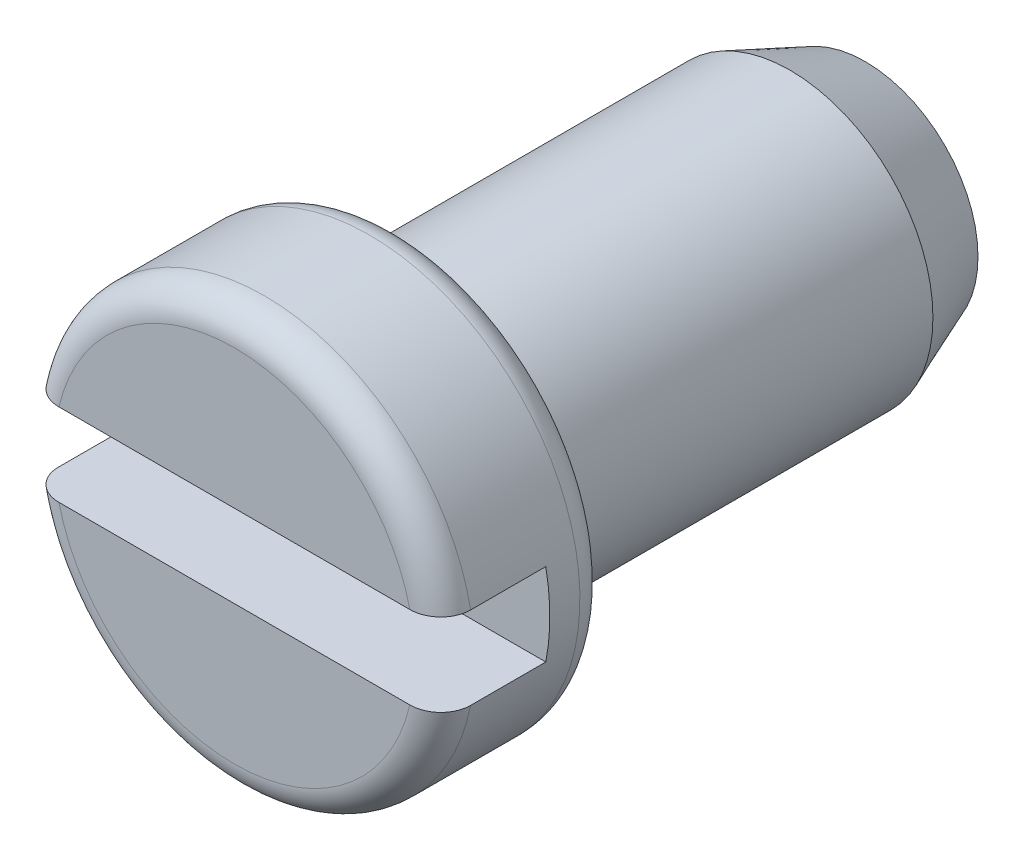
ISO-10303-21;
HEADER;
FILE_DESCRIPTION(('STEP AP214'),'2;1');
FILE_NAME('part.step','',(''),(''),'','','');
FILE_SCHEMA(('AUTOMOTIVE_DESIGN { 1 0 10303 214 1 1 1 1 }'));
ENDSEC;
DATA;
#1=APPLICATION_CONTEXT('core data for automotive mechanical design processes');
#2=APPLICATION_PROTOCOL_DEFINITION('international standard','automotive_design',2000,#1);
#3=PRODUCT_CONTEXT('',#1,'mechanical');
#4=PRODUCT('Part','Part','',(#3));
#5=PRODUCT_RELATED_PRODUCT_CATEGORY('part','',(#4));
#6=PRODUCT_DEFINITION_FORMATION('','',#4);
#7=PRODUCT_DEFINITION_CONTEXT('part definition',#1,'design');
#8=PRODUCT_DEFINITION('design','',#6,#7);
#9=PRODUCT_DEFINITION_SHAPE('','',#8);
#10=(LENGTH_UNIT() NAMED_UNIT(*) SI_UNIT(.MILLI.,.METRE.));
#11=(NAMED_UNIT(*) PLANE_ANGLE_UNIT() SI_UNIT($,.RADIAN.));
#12=(NAMED_UNIT(*) SI_UNIT($,.STERADIAN.) SOLID_ANGLE_UNIT());
#13=UNCERTAINTY_MEASURE_WITH_UNIT(LENGTH_MEASURE(1.E-05),#10,'distance_accuracy_value','');
#14=(GEOMETRIC_REPRESENTATION_CONTEXT(3) GLOBAL_UNCERTAINTY_ASSIGNED_CONTEXT((#13)) GLOBAL_UNIT_ASSIGNED_CONTEXT((#10,
#11,#12)) REPRESENTATION_CONTEXT('',''));
#15=CARTESIAN_POINT('',(0.,0.,0.));
#16=DIRECTION('',(0.,0.,1.));
#17=DIRECTION('',(1.,0.,0.));
#18=AXIS2_PLACEMENT_3D('',#15,#16,#17);
#19=CARTESIAN_POINT('',(0.,0.,0.4));
#20=DIRECTION('',(0.,0.,-1.));
#21=DIRECTION('',(-1.,0.,0.));
#22=AXIS2_PLACEMENT_3D('',#19,#20,#21);
#23=PLANE('',#22);
#24=DIRECTION('',(1.,0.,0.));
#25=VECTOR('',#24,1.);
#26=CARTESIAN_POINT('',(-1.55,0.275,0.4));
#27=LINE('',#26,#25);
#28=CARTESIAN_POINT('',(-1.37272539132962,0.275,0.4));
#29=VERTEX_POINT('',#28);
#30=CARTESIAN_POINT('',(1.37272539132912,0.275,0.4));
#31=VERTEX_POINT('',#30);
#32=EDGE_CURVE('E81',#29,#31,#27,.T.);
#33=ORIENTED_EDGE('',*,*,#32,.F.);
#34=CARTESIAN_POINT('',(0.,0.,0.4));
#35=DIRECTION('',(0.,0.,1.));
#36=DIRECTION('',(1.,0.,0.));
#37=AXIS2_PLACEMENT_3D('',#34,#35,#36);
#38=CIRCLE('',#37,1.4);
#39=CARTESIAN_POINT('',(-1.37272539132912,-0.275,0.4));
#40=VERTEX_POINT('',#39);
#41=EDGE_CURVE('E20',#40,#29,#38,.F.);
#42=ORIENTED_EDGE('',*,*,#41,.F.);
#43=DIRECTION('',(-1.,0.,0.));
#44=VECTOR('',#43,1.);
#45=CARTESIAN_POINT('',(1.55,-0.275,0.4));
#46=LINE('',#45,#44);
#47=CARTESIAN_POINT('',(1.37272539132912,-0.275,0.4));
#48=VERTEX_POINT('',#47);
#49=EDGE_CURVE('E101',#48,#40,#46,.T.);
#50=ORIENTED_EDGE('',*,*,#49,.F.);
#51=CARTESIAN_POINT('',(0.,0.,0.4));
#52=DIRECTION('',(0.,0.,1.));
#53=DIRECTION('',(1.,0.,0.));
#54=AXIS2_PLACEMENT_3D('',#51,#52,#53);
#55=CIRCLE('',#54,1.4);
#56=EDGE_CURVE('E79',#31,#48,#55,.F.);
#57=ORIENTED_EDGE('',*,*,#56,.F.);
#58=EDGE_LOOP('',(#33,#42,#50,#57));
#59=FACE_BOUND('',#58,.T.);
#60=ADVANCED_FACE('F17',(#59),#23,.F.);
#61=CARTESIAN_POINT('',(-1.55,0.275,0.4));
#62=DIRECTION('',(0.,-1.,0.));
#63=DIRECTION('',(1.,0.,0.));
#64=AXIS2_PLACEMENT_3D('',#61,#62,#63);
#65=PLANE('',#64);
#66=CARTESIAN_POINT('',(-1.168064638622,0.275,1.1));
#67=CARTESIAN_POINT('',(-1.17979474619244,0.275000000000899,1.10000900892487));
#68=CARTESIAN_POINT('',(-1.19152507678912,0.275000000000449,1.09902268463243));
#69=CARTESIAN_POINT('',(-1.21465961916008,0.274999999999551,1.09511289767747));
#70=CARTESIAN_POINT('',(-1.22606379501587,0.274999999999101,1.09218922251046));
#71=CARTESIAN_POINT('',(-1.24822679158968,0.2750000000009,1.08445477754249));
#72=CARTESIAN_POINT('',(-1.25898501760047,0.27500000000315,1.07964229858439));
#73=CARTESIAN_POINT('',(-1.27951893103669,0.274999999996852,1.06825432297092));
#74=CARTESIAN_POINT('',(-1.2892950745387,0.274999999988309,1.06167964992609));
#75=CARTESIAN_POINT('',(-1.30742885711329,0.274999999990221,1.04705254625198));
#76=CARTESIAN_POINT('',(-1.31580565043505,0.275000000000391,1.0390238749874));
#77=CARTESIAN_POINT('',(-1.33105410531582,0.274999999999609,1.02164641569087));
#78=CARTESIAN_POINT('',(-1.33792608226181,0.27499999998866,1.01229790495434));
#79=CARTESIAN_POINT('',(-1.3498135054974,0.274999999988767,0.992766466030646));
#80=CARTESIAN_POINT('',(-1.35486603138525,0.274999999999351,0.982606069770023));
#81=CARTESIAN_POINT('',(-1.36315638148696,0.275000000000648,0.961574435688257));
#82=CARTESIAN_POINT('',(-1.36639581565538,0.274999999991379,0.950703838108876));
#83=CARTESIAN_POINT('',(-1.37002349346129,0.274999999992961,0.933122145238303));
#84=CARTESIAN_POINT('',(-1.37103620489451,0.274999999997118,0.926533700301215));
#85=CARTESIAN_POINT('',(-1.372386912745,0.275000000002878,0.913297877139153));
#86=CARTESIAN_POINT('',(-1.37272590503939,0.275000000004483,0.906650600510395));
#87=CARTESIAN_POINT('',(-1.37272539132924,0.274999999999991,0.900000000000005));
#88=B_SPLINE_CURVE_WITH_KNOTS('',3,(#66,#67,#68,#69,#70,#71,#72,#73,#74,#75,#76,#77,#78,#79,#80,
#81,#82,#83,#84,#85,#86,#87),.UNSPECIFIED.,.F.,.F.,(4,2,2,2,2,2,2,2,2,2,4),(0.,
0.0351495831407126,0.0703030224135915,0.105488345247945,0.140657251830126,0.175296238170142,
0.209927957734105,0.243807528246284,0.277656967101562,0.297623162227171,0.317559821736661),.UNSPECIFIED.);
#89=CARTESIAN_POINT('',(-1.168064638622,0.275,1.1));
#90=VERTEX_POINT('',#89);
#91=CARTESIAN_POINT('',(-1.37272539132962,0.275,0.9));
#92=VERTEX_POINT('',#91);
#93=EDGE_CURVE('E90',#90,#92,#88,.T.);
#94=ORIENTED_EDGE('',*,*,#93,.T.);
#95=DIRECTION('',(0.,0.,1.));
#96=VECTOR('',#95,1.);
#97=CARTESIAN_POINT('',(-1.37272539133,0.275,0.4));
#98=LINE('',#97,#96);
#99=EDGE_CURVE('E72',#92,#29,#98,.F.);
#100=ORIENTED_EDGE('',*,*,#99,.T.);
#101=ORIENTED_EDGE('',*,*,#32,.T.);
#102=DIRECTION('',(0.,0.,1.));
#103=VECTOR('',#102,1.);
#104=CARTESIAN_POINT('',(1.372725391329,0.275,0.4));
#105=LINE('',#104,#103);
#106=CARTESIAN_POINT('',(1.37272539132912,0.275,0.9));
#107=VERTEX_POINT('',#106);
#108=EDGE_CURVE('E85',#31,#107,#105,.T.);
#109=ORIENTED_EDGE('',*,*,#108,.T.);
#110=CARTESIAN_POINT('',(1.37272539132923,0.275,0.9));
#111=CARTESIAN_POINT('',(1.37273572942247,0.275,0.911086101343287));
#112=CARTESIAN_POINT('',(1.37178597217092,0.275,0.922168228237445));
#113=CARTESIAN_POINT('',(1.36804386496671,0.275000000000001,0.944002810205124));
#114=CARTESIAN_POINT('',(1.36525388933003,0.275000000000001,0.954755671426613));
#115=CARTESIAN_POINT('',(1.35790742588791,0.275000000000001,0.975643414756284));
#116=CARTESIAN_POINT('',(1.35335038323878,0.275,0.985778101605212));
#117=CARTESIAN_POINT('',(1.34261311878456,0.275000000000001,1.00514589252457));
#118=CARTESIAN_POINT('',(1.33643295835292,0.275000000000001,1.01437903066631));
#119=CARTESIAN_POINT('',(1.322579909604,0.275000000000001,1.03176413579918));
#120=CARTESIAN_POINT('',(1.31489589333472,0.275,1.03990723001668));
#121=CARTESIAN_POINT('',(1.29829140126117,0.275,1.05481705570486));
#122=CARTESIAN_POINT('',(1.28937073967939,0.275000000000001,1.06158357999999));
#123=CARTESIAN_POINT('',(1.27037008819324,0.275000000000001,1.07368543886463));
#124=CARTESIAN_POINT('',(1.26027143895148,0.275,1.07899144095497));
#125=CARTESIAN_POINT('',(1.23934070951141,0.275000000000001,1.08787313057687));
#126=CARTESIAN_POINT('',(1.22850877690593,0.275000000000002,1.09144916513707));
#127=CARTESIAN_POINT('',(1.20937822381537,0.274999999999999,1.09607683913528));
#128=CARTESIAN_POINT('',(1.20117826995077,0.274999999999996,1.09754809729308));
#129=CARTESIAN_POINT('',(1.18467449380895,0.275000000000004,1.09950964714614));
#130=CARTESIAN_POINT('',(1.17637084906966,0.275000000000015,1.10000143191338));
#131=CARTESIAN_POINT('',(1.16806463862198,0.275000000000041,1.1));
#132=B_SPLINE_CURVE_WITH_KNOTS('',3,(#110,#111,#112,#113,#114,#115,#116,#117,#118,#119,#120,
#121,#122,#123,#124,#125,#126,#127,#128,#129,#130,#131),.UNSPECIFIED.,.F.,.F.,(4,2,2,2,2,2,2,2,
2,2,4),(0.,0.0332117839812641,0.0663808005275269,0.0995602403012769,0.132738425672459,
0.16617209183135,0.199610786083897,0.23367881316475,0.267740003418682,0.292676943506943,
0.31757584148912),.UNSPECIFIED.);
#133=CARTESIAN_POINT('',(1.168064638622,0.275,1.1));
#134=VERTEX_POINT('',#133);
#135=EDGE_CURVE('E94',#107,#134,#132,.T.);
#136=ORIENTED_EDGE('',*,*,#135,.T.);
#137=DIRECTION('',(-1.,0.,0.));
#138=VECTOR('',#137,1.);
#139=CARTESIAN_POINT('',(0.,0.275,1.1));
#140=LINE('',#139,#138);
#141=EDGE_CURVE('E176',#134,#90,#140,.T.);
#142=ORIENTED_EDGE('',*,*,#141,.T.);
#143=EDGE_LOOP('',(#94,#100,#101,#109,#136,#142));
#144=FACE_BOUND('',#143,.T.);
#145=ADVANCED_FACE('F88',(#144),#65,.T.);
#146=CARTESIAN_POINT('',(1.55,-0.275,0.4));
#147=DIRECTION('',(0.,1.,0.));
#148=DIRECTION('',(-1.,0.,0.));
#149=AXIS2_PLACEMENT_3D('',#146,#147,#148);
#150=PLANE('',#149);
#151=ORIENTED_EDGE('',*,*,#49,.T.);
#152=DIRECTION('',(0.,0.,1.));
#153=VECTOR('',#152,1.);
#154=CARTESIAN_POINT('',(-1.372725391329,-0.275,0.4));
#155=LINE('',#154,#153);
#156=CARTESIAN_POINT('',(-1.37272539132912,-0.275000000000001,0.9));
#157=VERTEX_POINT('',#156);
#158=EDGE_CURVE('E75',#40,#157,#155,.T.);
#159=ORIENTED_EDGE('',*,*,#158,.T.);
#160=CARTESIAN_POINT('',(-1.37272539132923,-0.275000000000001,0.9));
#161=CARTESIAN_POINT('',(-1.37273572942247,-0.275000000000001,0.911086101343287));
#162=CARTESIAN_POINT('',(-1.37178597217092,-0.275000000000001,0.922168228237444));
#163=CARTESIAN_POINT('',(-1.36804386496671,-0.275,0.944002810205124));
#164=CARTESIAN_POINT('',(-1.36525388933003,-0.275,0.954755671426613));
#165=CARTESIAN_POINT('',(-1.35790742588791,-0.275,0.975643414756284));
#166=CARTESIAN_POINT('',(-1.35335038323878,-0.275,0.985778101605212));
#167=CARTESIAN_POINT('',(-1.34261311878456,-0.275000000000001,1.00514589252457));
#168=CARTESIAN_POINT('',(-1.33643295835292,-0.275,1.01437903066631));
#169=CARTESIAN_POINT('',(-1.322579909604,-0.275,1.03176413579918));
#170=CARTESIAN_POINT('',(-1.31489589333472,-0.275,1.03990723001668));
#171=CARTESIAN_POINT('',(-1.29829140126118,-0.275,1.05481705570486));
#172=CARTESIAN_POINT('',(-1.28937073967939,-0.275,1.06158357999999));
#173=CARTESIAN_POINT('',(-1.27037008819324,-0.275,1.07368543886463));
#174=CARTESIAN_POINT('',(-1.26027143895148,-0.275,1.07899144095497));
#175=CARTESIAN_POINT('',(-1.23934070951141,-0.275000000000001,1.08787313057687));
#176=CARTESIAN_POINT('',(-1.22850877690593,-0.275000000000002,1.09144916513707));
#177=CARTESIAN_POINT('',(-1.20937822381537,-0.274999999999999,1.09607683913528));
#178=CARTESIAN_POINT('',(-1.20117826995077,-0.274999999999996,1.09754809729308));
#179=CARTESIAN_POINT('',(-1.18467449380895,-0.275000000000004,1.09950964714614));
#180=CARTESIAN_POINT('',(-1.17637084906966,-0.275000000000015,1.10000143191338));
#181=CARTESIAN_POINT('',(-1.16806463862198,-0.275000000000041,1.1));
#182=B_SPLINE_CURVE_WITH_KNOTS('',3,(#160,#161,#162,#163,#164,#165,#166,#167,#168,#169,#170,
#171,#172,#173,#174,#175,#176,#177,#178,#179,#180,#181),.UNSPECIFIED.,.F.,.F.,(4,2,2,2,2,2,2,2,
2,2,4),(0.,0.033211783981264,0.0663808005275267,0.0995602403012767,0.132738425672459,
0.166172091831349,0.199610786083897,0.233678813164749,0.267740003418681,0.292676943506943,
0.317575841489121),.UNSPECIFIED.);
#183=CARTESIAN_POINT('',(-1.168064638622,-0.275,1.1));
#184=VERTEX_POINT('',#183);
#185=EDGE_CURVE('E35',#157,#184,#182,.T.);
#186=ORIENTED_EDGE('',*,*,#185,.T.);
#187=DIRECTION('',(-1.,0.,0.));
#188=VECTOR('',#187,1.);
#189=CARTESIAN_POINT('',(0.,-0.275,1.1));
#190=LINE('',#189,#188);
#191=CARTESIAN_POINT('',(1.168064638622,-0.275,1.1));
#192=VERTEX_POINT('',#191);
#193=EDGE_CURVE('E156',#184,#192,#190,.F.);
#194=ORIENTED_EDGE('',*,*,#193,.T.);
#195=CARTESIAN_POINT('',(1.168064638622,-0.275,1.1));
#196=CARTESIAN_POINT('',(1.17979474619244,-0.275000000000899,1.10000900892487));
#197=CARTESIAN_POINT('',(1.19152507678912,-0.275000000000449,1.09902268463243));
#198=CARTESIAN_POINT('',(1.21465961916008,-0.274999999999551,1.09511289767747));
#199=CARTESIAN_POINT('',(1.22606379501587,-0.274999999999101,1.09218922251046));
#200=CARTESIAN_POINT('',(1.24822679158968,-0.2750000000009,1.08445477754249));
#201=CARTESIAN_POINT('',(1.25898501760047,-0.27500000000315,1.07964229858439));
#202=CARTESIAN_POINT('',(1.27951893103669,-0.274999999996852,1.06825432297091));
#203=CARTESIAN_POINT('',(1.2892950745387,-0.274999999988308,1.06167964992609));
#204=CARTESIAN_POINT('',(1.30742885711329,-0.27499999999022,1.04705254625198));
#205=CARTESIAN_POINT('',(1.31580565043505,-0.275000000000391,1.0390238749874));
#206=CARTESIAN_POINT('',(1.33105410531582,-0.274999999999609,1.02164641569087));
#207=CARTESIAN_POINT('',(1.33792608226181,-0.27499999998866,1.01229790495434));
#208=CARTESIAN_POINT('',(1.3498135054974,-0.274999999988768,0.992766466030646));
#209=CARTESIAN_POINT('',(1.35486603138525,-0.274999999999351,0.982606069770023));
#210=CARTESIAN_POINT('',(1.36315638148696,-0.275000000000648,0.961574435688257));
#211=CARTESIAN_POINT('',(1.36639581565538,-0.274999999991379,0.950703838108876));
#212=CARTESIAN_POINT('',(1.37002349346129,-0.27499999999296,0.933122145238303));
#213=CARTESIAN_POINT('',(1.37103620489451,-0.274999999997118,0.926533700301215));
#214=CARTESIAN_POINT('',(1.372386912745,-0.275000000002878,0.913297877139153));
#215=CARTESIAN_POINT('',(1.37272590503939,-0.275000000004483,0.906650600510395));
#216=CARTESIAN_POINT('',(1.37272539132924,-0.27499999999999,0.900000000000005));
#217=B_SPLINE_CURVE_WITH_KNOTS('',3,(#195,#196,#197,#198,#199,#200,#201,#202,#203,#204,#205,
#206,#207,#208,#209,#210,#211,#212,#213,#214,#215,#216),.UNSPECIFIED.,.F.,.F.,(4,2,2,2,2,2,2,2,
2,2,4),(0.,0.0351495831407126,0.0703030224135915,0.105488345247944,0.140657251830126,
0.175296238170141,0.209927957734105,0.243807528246283,0.277656967101562,0.29762316222717,
0.31755982173666),.UNSPECIFIED.);
#218=CARTESIAN_POINT('',(1.37272539132912,-0.275,0.9));
#219=VERTEX_POINT('',#218);
#220=EDGE_CURVE('E92',#192,#219,#217,.T.);
#221=ORIENTED_EDGE('',*,*,#220,.T.);
#222=DIRECTION('',(0.,0.,1.));
#223=VECTOR('',#222,1.);
#224=CARTESIAN_POINT('',(1.372725391329,-0.275,0.4));
#225=LINE('',#224,#223);
#226=EDGE_CURVE('E98',#219,#48,#225,.F.);
#227=ORIENTED_EDGE('',*,*,#226,.T.);
#228=EDGE_LOOP('',(#151,#159,#186,#194,#221,#227));
#229=FACE_BOUND('',#228,.T.);
#230=ADVANCED_FACE('F118',(#229),#150,.T.);
#231=CARTESIAN_POINT('',(0.,0.,1.1));
#232=DIRECTION('',(0.,0.,-1.));
#233=DIRECTION('',(-1.,0.,0.));
#234=AXIS2_PLACEMENT_3D('',#231,#232,#233);
#235=PLANE('',#234);
#236=CARTESIAN_POINT('',(0.,0.,1.1));
#237=DIRECTION('',(0.,0.,-1.));
#238=DIRECTION('',(-0.973387198851956,0.229166666666735,0.));
#239=AXIS2_PLACEMENT_3D('',#236,#237,#238);
#240=CIRCLE('',#239,1.19999999999964);
#241=EDGE_CURVE('E188',#90,#134,#240,.T.);
#242=ORIENTED_EDGE('',*,*,#241,.F.);
#243=ORIENTED_EDGE('',*,*,#141,.F.);
#244=EDGE_LOOP('',(#242,#243));
#245=FACE_BOUND('',#244,.T.);
#246=ADVANCED_FACE('F166',(#245),#235,.F.);
#247=CARTESIAN_POINT('',(0.,0.,1.1));
#248=DIRECTION('',(0.,0.,-1.));
#249=DIRECTION('',(-1.,0.,0.));
#250=AXIS2_PLACEMENT_3D('',#247,#248,#249);
#251=PLANE('',#250);
#252=CARTESIAN_POINT('',(0.,0.,1.1));
#253=DIRECTION('',(0.,0.,-1.));
#254=DIRECTION('',(0.973387198851956,-0.229166666666734,0.));
#255=AXIS2_PLACEMENT_3D('',#252,#253,#254);
#256=CIRCLE('',#255,1.19999999999964);
#257=EDGE_CURVE('E148',#192,#184,#256,.T.);
#258=ORIENTED_EDGE('',*,*,#257,.F.);
#259=ORIENTED_EDGE('',*,*,#193,.F.);
#260=EDGE_LOOP('',(#258,#259));
#261=FACE_BOUND('',#260,.T.);
#262=ADVANCED_FACE('F158',(#261),#251,.F.);
#263=CARTESIAN_POINT('',(0.,0.,0.9));
#264=DIRECTION('',(0.,0.,-1.));
#265=DIRECTION('',(-1.,0.,0.));
#266=AXIS2_PLACEMENT_3D('',#263,#264,#265);
#267=TOROIDAL_SURFACE('',#266,1.2,0.2);
#268=ORIENTED_EDGE('',*,*,#241,.T.);
#269=ORIENTED_EDGE('',*,*,#135,.F.);
#270=CARTESIAN_POINT('',(0.,0.,0.9));
#271=DIRECTION('',(0.,0.,1.));
#272=DIRECTION('',(1.,0.,0.));
#273=AXIS2_PLACEMENT_3D('',#270,#271,#272);
#274=CIRCLE('',#273,1.4);
#275=EDGE_CURVE('E144',#92,#107,#274,.F.);
#276=ORIENTED_EDGE('',*,*,#275,.F.);
#277=ORIENTED_EDGE('',*,*,#93,.F.);
#278=EDGE_LOOP('',(#268,#269,#276,#277));
#279=FACE_BOUND('',#278,.T.);
#280=ADVANCED_FACE('F127',(#279),#267,.T.);
#281=CARTESIAN_POINT('',(0.,0.,0.9));
#282=DIRECTION('',(0.,0.,-1.));
#283=DIRECTION('',(-1.,0.,0.));
#284=AXIS2_PLACEMENT_3D('',#281,#282,#283);
#285=TOROIDAL_SURFACE('',#284,1.2,0.2);
#286=CARTESIAN_POINT('',(0.,0.,0.9));
#287=DIRECTION('',(0.,0.,1.));
#288=DIRECTION('',(1.,0.,0.));
#289=AXIS2_PLACEMENT_3D('',#286,#287,#288);
#290=CIRCLE('',#289,1.4);
#291=EDGE_CURVE('E143',#219,#157,#290,.F.);
#292=ORIENTED_EDGE('',*,*,#291,.F.);
#293=ORIENTED_EDGE('',*,*,#220,.F.);
#294=ORIENTED_EDGE('',*,*,#257,.T.);
#295=ORIENTED_EDGE('',*,*,#185,.F.);
#296=EDGE_LOOP('',(#292,#293,#294,#295));
#297=FACE_BOUND('',#296,.T.);
#298=ADVANCED_FACE('F121',(#297),#285,.T.);
#299=CARTESIAN_POINT('',(0.,0.,1.1));
#300=DIRECTION('',(0.,0.,1.));
#301=DIRECTION('',(1.,0.,0.));
#302=AXIS2_PLACEMENT_3D('',#299,#300,#301);
#303=CYLINDRICAL_SURFACE('',#302,1.4);
#304=ORIENTED_EDGE('',*,*,#158,.F.);
#305=ORIENTED_EDGE('',*,*,#41,.T.);
#306=ORIENTED_EDGE('',*,*,#99,.F.);
#307=ORIENTED_EDGE('',*,*,#275,.T.);
#308=ORIENTED_EDGE('',*,*,#108,.F.);
#309=ORIENTED_EDGE('',*,*,#56,.T.);
#310=ORIENTED_EDGE('',*,*,#226,.F.);
#311=ORIENTED_EDGE('',*,*,#291,.T.);
#312=EDGE_LOOP('',(#304,#305,#306,#307,#308,#309,#310,#311));
#313=FACE_BOUND('',#312,.T.);
#314=CARTESIAN_POINT('',(0.,0.,0.2));
#315=DIRECTION('',(0.,0.,-1.));
#316=DIRECTION('',(-1.,0.,0.));
#317=AXIS2_PLACEMENT_3D('',#314,#315,#316);
#318=CIRCLE('',#317,1.4);
#319=CARTESIAN_POINT('',(-1.4,0.,0.2));
#320=VERTEX_POINT('',#319);
#321=EDGE_CURVE('E107',#320,#320,#318,.T.);
#322=ORIENTED_EDGE('',*,*,#321,.F.);
#323=EDGE_LOOP('',(#322));
#324=FACE_BOUND('',#323,.T.);
#325=ADVANCED_FACE('F68',(#313,#324),#303,.T.);
#326=CARTESIAN_POINT('',(0.,0.,-3.1));
#327=DIRECTION('',(0.,0.,1.));
#328=DIRECTION('',(1.,0.,0.));
#329=AXIS2_PLACEMENT_3D('',#326,#327,#328);
#330=PLANE('',#329);
#331=CARTESIAN_POINT('',(0.,0.,-3.10000000001764));
#332=DIRECTION('',(0.,0.,1.));
#333=DIRECTION('',(1.,0.,0.));
#334=AXIS2_PLACEMENT_3D('',#331,#332,#333);
#335=CIRCLE('',#334,0.749999999982265);
#336=CARTESIAN_POINT('',(0.749999999982265,0.,-3.10000000001764));
#337=VERTEX_POINT('',#336);
#338=EDGE_CURVE('E103',#337,#337,#335,.T.);
#339=ORIENTED_EDGE('',*,*,#338,.F.);
#340=EDGE_LOOP('',(#339));
#341=FACE_BOUND('',#340,.T.);
#342=ADVANCED_FACE('F265',(#341),#330,.F.);
#343=CARTESIAN_POINT('',(0.,0.,0.2));
#344=DIRECTION('',(0.,0.,-1.));
#345=DIRECTION('',(-1.,0.,0.));
#346=AXIS2_PLACEMENT_3D('',#343,#344,#345);
#347=TOROIDAL_SURFACE('',#346,1.2,0.2);
#348=CARTESIAN_POINT('',(0.,0.,0.));
#349=DIRECTION('',(0.,0.,1.));
#350=DIRECTION('',(-1.,0.,0.));
#351=AXIS2_PLACEMENT_3D('',#348,#349,#350);
#352=CIRCLE('',#351,1.2);
#353=CARTESIAN_POINT('',(-1.2,0.,0.));
#354=VERTEX_POINT('',#353);
#355=EDGE_CURVE('E106',#354,#354,#352,.F.);
#356=ORIENTED_EDGE('',*,*,#355,.F.);
#357=EDGE_LOOP('',(#356));
#358=FACE_BOUND('',#357,.T.);
#359=ORIENTED_EDGE('',*,*,#321,.T.);
#360=EDGE_LOOP('',(#359));
#361=FACE_BOUND('',#360,.T.);
#362=ADVANCED_FACE('F262',(#358,#361),#347,.T.);
#363=CARTESIAN_POINT('',(0.,0.,-2.60000000002947));
#364=DIRECTION('',(0.,0.,1.));
#365=DIRECTION('',(1.,0.,0.));
#366=AXIS2_PLACEMENT_3D('',#363,#364,#365);
#367=CONICAL_SURFACE('',#366,0.949999999960482,0.380506377082963);
#368=CARTESIAN_POINT('',(0.,0.,-2.6));
#369=DIRECTION('',(0.,0.,-1.));
#370=DIRECTION('',(-1.,0.,0.));
#371=AXIS2_PLACEMENT_3D('',#368,#369,#370);
#372=CIRCLE('',#371,0.95);
#373=CARTESIAN_POINT('',(-0.95,0.,-2.6));
#374=VERTEX_POINT('',#373);
#375=EDGE_CURVE('E26',#374,#374,#372,.F.);
#376=ORIENTED_EDGE('',*,*,#375,.F.);
#377=EDGE_LOOP('',(#376));
#378=FACE_BOUND('',#377,.T.);
#379=ORIENTED_EDGE('',*,*,#338,.T.);
#380=EDGE_LOOP('',(#379));
#381=FACE_BOUND('',#380,.T.);
#382=ADVANCED_FACE('F242',(#378,#381),#367,.T.);
#383=CARTESIAN_POINT('',(0.,0.,0.));
#384=DIRECTION('',(0.,0.,-1.));
#385=DIRECTION('',(-1.,0.,0.));
#386=AXIS2_PLACEMENT_3D('',#383,#384,#385);
#387=PLANE('',#386);
#388=CARTESIAN_POINT('',(0.,0.,0.));
#389=DIRECTION('',(0.,0.,-1.));
#390=DIRECTION('',(-1.,0.,0.));
#391=AXIS2_PLACEMENT_3D('',#388,#389,#390);
#392=CIRCLE('',#391,0.95);
#393=CARTESIAN_POINT('',(-0.95,0.,0.));
#394=VERTEX_POINT('',#393);
#395=EDGE_CURVE('E11',#394,#394,#392,.T.);
#396=ORIENTED_EDGE('',*,*,#395,.F.);
#397=EDGE_LOOP('',(#396));
#398=FACE_BOUND('',#397,.T.);
#399=ORIENTED_EDGE('',*,*,#355,.T.);
#400=EDGE_LOOP('',(#399));
#401=FACE_BOUND('',#400,.T.);
#402=ADVANCED_FACE('F235',(#398,#401),#387,.T.);
#403=CARTESIAN_POINT('',(0.,0.,-3.1));
#404=DIRECTION('',(0.,0.,-1.));
#405=DIRECTION('',(-1.,0.,0.));
#406=AXIS2_PLACEMENT_3D('',#403,#404,#405);
#407=CYLINDRICAL_SURFACE('',#406,0.95);
#408=ORIENTED_EDGE('',*,*,#395,.T.);
#409=EDGE_LOOP('',(#408));
#410=FACE_BOUND('',#409,.T.);
#411=ORIENTED_EDGE('',*,*,#375,.T.);
#412=EDGE_LOOP('',(#411));
#413=FACE_BOUND('',#412,.T.);
#414=ADVANCED_FACE('F233',(#410,#413),#407,.T.);
#415=CLOSED_SHELL('',(#60,#145,#230,#246,#262,#280,#298,#325,#342,#362,#382,#402,#414));
#416=MANIFOLD_SOLID_BREP('B1',#415);
#417=ADVANCED_BREP_SHAPE_REPRESENTATION('',(#18,#416),#14);
#418=SHAPE_DEFINITION_REPRESENTATION(#9,#417);
ENDSEC;
END-ISO-10303-21;
